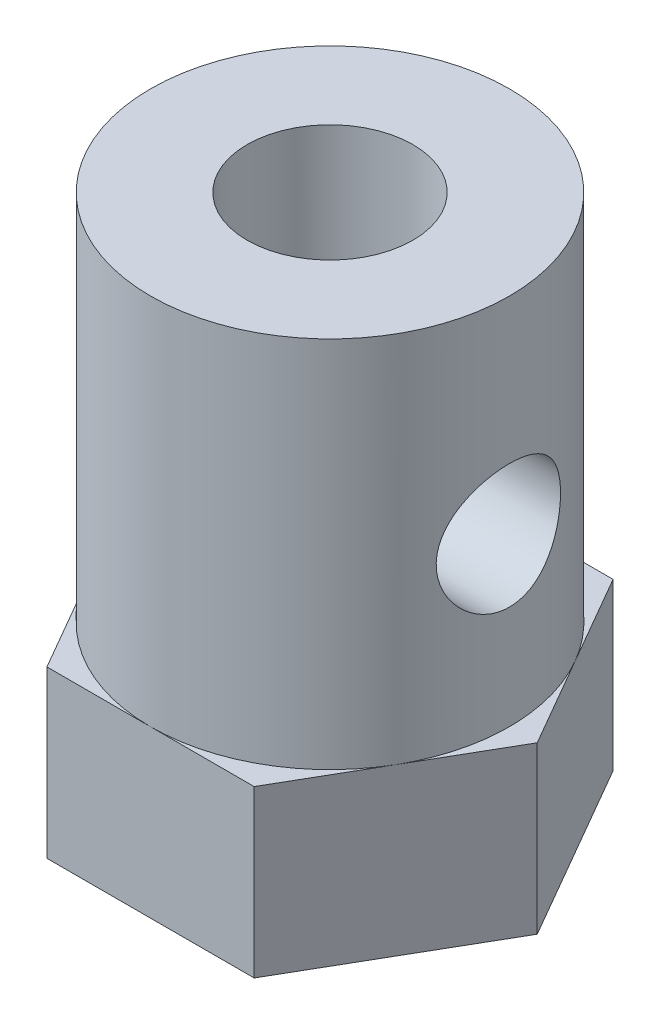
ISO-10303-21;
HEADER;
FILE_DESCRIPTION(('STEP AP214'),'2;1');
FILE_NAME('part.step','',(''),(''),'','','');
FILE_SCHEMA(('AUTOMOTIVE_DESIGN { 1 0 10303 214 1 1 1 1 }'));
ENDSEC;
DATA;
#1=APPLICATION_CONTEXT('core data for automotive mechanical design processes');
#2=APPLICATION_PROTOCOL_DEFINITION('international standard','automotive_design',2000,#1);
#3=PRODUCT_CONTEXT('',#1,'mechanical');
#4=PRODUCT('Part','Part','',(#3));
#5=PRODUCT_RELATED_PRODUCT_CATEGORY('part','',(#4));
#6=PRODUCT_DEFINITION_FORMATION('','',#4);
#7=PRODUCT_DEFINITION_CONTEXT('part definition',#1,'design');
#8=PRODUCT_DEFINITION('design','',#6,#7);
#9=PRODUCT_DEFINITION_SHAPE('','',#8);
#10=(LENGTH_UNIT() NAMED_UNIT(*) SI_UNIT(.MILLI.,.METRE.));
#11=(NAMED_UNIT(*) PLANE_ANGLE_UNIT() SI_UNIT($,.RADIAN.));
#12=(NAMED_UNIT(*) SI_UNIT($,.STERADIAN.) SOLID_ANGLE_UNIT());
#13=UNCERTAINTY_MEASURE_WITH_UNIT(LENGTH_MEASURE(1.E-05),#10,'distance_accuracy_value','');
#14=(GEOMETRIC_REPRESENTATION_CONTEXT(3) GLOBAL_UNCERTAINTY_ASSIGNED_CONTEXT((#13)) GLOBAL_UNIT_ASSIGNED_CONTEXT((#10,
#11,#12)) REPRESENTATION_CONTEXT('',''));
#15=CARTESIAN_POINT('',(0.,0.,0.));
#16=DIRECTION('',(0.,0.,1.));
#17=DIRECTION('',(1.,0.,0.));
#18=AXIS2_PLACEMENT_3D('',#15,#16,#17);
#19=CARTESIAN_POINT('',(0.,4.,0.));
#20=DIRECTION('',(0.,1.,0.));
#21=DIRECTION('',(0.,0.,1.));
#22=AXIS2_PLACEMENT_3D('',#19,#20,#21);
#23=PLANE('',#22);
#24=CARTESIAN_POINT('',(0.,4.,0.));
#25=DIRECTION('',(0.,1.,0.));
#26=DIRECTION('',(0.,0.,1.));
#27=AXIS2_PLACEMENT_3D('',#24,#25,#26);
#28=CIRCLE('',#27,4.33012701892221);
#29=CARTESIAN_POINT('',(-6.66133814775094E-12,4.,4.33012701892221));
#30=VERTEX_POINT('',#29);
#31=CARTESIAN_POINT('',(3.75,4.,2.16506350946109));
#32=VERTEX_POINT('',#31);
#33=EDGE_CURVE('E54',#30,#32,#28,.T.);
#34=ORIENTED_EDGE('',*,*,#33,.F.);
#35=DIRECTION('',(1.,0.,0.));
#36=VECTOR('',#35,1.);
#37=CARTESIAN_POINT('',(-6.66133814775094E-12,4.,4.3301270189222));
#38=LINE('',#37,#36);
#39=CARTESIAN_POINT('',(2.49999999999337,4.,4.3301270189222));
#40=VERTEX_POINT('',#39);
#41=EDGE_CURVE('E124',#30,#40,#38,.T.);
#42=ORIENTED_EDGE('',*,*,#41,.T.);
#43=DIRECTION('',(0.499999999999998,0.,-0.866025403784466));
#44=VECTOR('',#43,1.);
#45=CARTESIAN_POINT('',(3.75,4.,2.16506350946109));
#46=LINE('',#45,#44);
#47=EDGE_CURVE('E134',#40,#32,#46,.T.);
#48=ORIENTED_EDGE('',*,*,#47,.T.);
#49=EDGE_LOOP('',(#34,#42,#48));
#50=FACE_BOUND('',#49,.T.);
#51=ADVANCED_FACE('F38',(#50),#23,.T.);
#52=CARTESIAN_POINT('',(3.74999999999334,4.,-2.1650635094612));
#53=VERTEX_POINT('',#52);
#54=EDGE_CURVE('E11',#32,#53,#28,.T.);
#55=ORIENTED_EDGE('',*,*,#54,.F.);
#56=CARTESIAN_POINT('',(5.,4.,0.));
#57=VERTEX_POINT('',#56);
#58=EDGE_CURVE('E150',#32,#57,#46,.T.);
#59=ORIENTED_EDGE('',*,*,#58,.T.);
#60=DIRECTION('',(-0.5,0.,-0.866025403784439));
#61=VECTOR('',#60,1.);
#62=CARTESIAN_POINT('',(3.74999999999334,4.,-2.1650635094612));
#63=LINE('',#62,#61);
#64=EDGE_CURVE('E151',#57,#53,#63,.T.);
#65=ORIENTED_EDGE('',*,*,#64,.T.);
#66=EDGE_LOOP('',(#55,#59,#65));
#67=FACE_BOUND('',#66,.T.);
#68=ADVANCED_FACE('F259',(#67),#23,.T.);
#69=CARTESIAN_POINT('',(0.,4.,-4.33012701892219));
#70=VERTEX_POINT('',#69);
#71=EDGE_CURVE('E52',#53,#70,#28,.T.);
#72=ORIENTED_EDGE('',*,*,#71,.F.);
#73=CARTESIAN_POINT('',(2.5,4.,-4.33012701892219));
#74=VERTEX_POINT('',#73);
#75=EDGE_CURVE('E149',#53,#74,#63,.T.);
#76=ORIENTED_EDGE('',*,*,#75,.T.);
#77=DIRECTION('',(-1.,0.,0.));
#78=VECTOR('',#77,1.);
#79=CARTESIAN_POINT('',(0.,4.,-4.33012701892219));
#80=LINE('',#79,#78);
#81=EDGE_CURVE('E155',#74,#70,#80,.T.);
#82=ORIENTED_EDGE('',*,*,#81,.T.);
#83=EDGE_LOOP('',(#72,#76,#82));
#84=FACE_BOUND('',#83,.T.);
#85=ADVANCED_FACE('F263',(#84),#23,.T.);
#86=CARTESIAN_POINT('',(-3.75,4.,-2.1650635094612));
#87=VERTEX_POINT('',#86);
#88=EDGE_CURVE('E141',#70,#87,#28,.T.);
#89=ORIENTED_EDGE('',*,*,#88,.F.);
#90=CARTESIAN_POINT('',(-2.50000000000333,4.,-4.3301270189224));
#91=VERTEX_POINT('',#90);
#92=EDGE_CURVE('E154',#70,#91,#80,.T.);
#93=ORIENTED_EDGE('',*,*,#92,.T.);
#94=DIRECTION('',(-0.5,0.,0.866025403784465));
#95=VECTOR('',#94,1.);
#96=CARTESIAN_POINT('',(-3.75,4.,-2.1650635094612));
#97=LINE('',#96,#95);
#98=EDGE_CURVE('E159',#91,#87,#97,.T.);
#99=ORIENTED_EDGE('',*,*,#98,.T.);
#100=EDGE_LOOP('',(#89,#93,#99));
#101=FACE_BOUND('',#100,.T.);
#102=ADVANCED_FACE('F268',(#101),#23,.T.);
#103=CARTESIAN_POINT('',(-3.75000000000332,4.,2.16506350946089));
#104=VERTEX_POINT('',#103);
#105=EDGE_CURVE('E68',#87,#104,#28,.T.);
#106=ORIENTED_EDGE('',*,*,#105,.F.);
#107=CARTESIAN_POINT('',(-5.00000000000334,4.,-2.07299455379228E-13));
#108=VERTEX_POINT('',#107);
#109=EDGE_CURVE('E158',#87,#108,#97,.T.);
#110=ORIENTED_EDGE('',*,*,#109,.T.);
#111=DIRECTION('',(-0.500000000000001,0.,-0.866025403784465));
#112=VECTOR('',#111,1.);
#113=CARTESIAN_POINT('',(-3.75000000000332,4.,2.16506350946089));
#114=LINE('',#113,#112);
#115=EDGE_CURVE('E162',#104,#108,#114,.T.);
#116=ORIENTED_EDGE('',*,*,#115,.F.);
#117=EDGE_LOOP('',(#106,#110,#116));
#118=FACE_BOUND('',#117,.T.);
#119=ADVANCED_FACE('F256',(#118),#23,.T.);
#120=CARTESIAN_POINT('',(3.75,4.,2.16506350946109));
#121=DIRECTION('',(-0.866025403784467,0.,-0.499999999999998));
#122=DIRECTION('',(-0.499999999999998,0.,0.866025403784467));
#123=AXIS2_PLACEMENT_3D('',#120,#121,#122);
#124=PLANE('',#123);
#125=DIRECTION('',(0.499999999999998,0.,-0.866025403784466));
#126=VECTOR('',#125,1.);
#127=CARTESIAN_POINT('',(3.75,0.,2.16506350946109));
#128=LINE('',#127,#126);
#129=CARTESIAN_POINT('',(2.49999999999337,0.,4.3301270189222));
#130=VERTEX_POINT('',#129);
#131=CARTESIAN_POINT('',(5.,0.,0.));
#132=VERTEX_POINT('',#131);
#133=EDGE_CURVE('E164',#130,#132,#128,.T.);
#134=ORIENTED_EDGE('',*,*,#133,.T.);
#135=DIRECTION('',(0.,-1.,0.));
#136=VECTOR('',#135,1.);
#137=CARTESIAN_POINT('',(5.,4.,0.));
#138=LINE('',#137,#136);
#139=EDGE_CURVE('E140',#57,#132,#138,.T.);
#140=ORIENTED_EDGE('',*,*,#139,.F.);
#141=ORIENTED_EDGE('',*,*,#58,.F.);
#142=ORIENTED_EDGE('',*,*,#47,.F.);
#143=DIRECTION('',(0.,-1.,0.));
#144=VECTOR('',#143,1.);
#145=CARTESIAN_POINT('',(2.49999999999337,4.,4.3301270189222));
#146=LINE('',#145,#144);
#147=EDGE_CURVE('E123',#40,#130,#146,.T.);
#148=ORIENTED_EDGE('',*,*,#147,.T.);
#149=EDGE_LOOP('',(#134,#140,#141,#142,#148));
#150=FACE_BOUND('',#149,.T.);
#151=ADVANCED_FACE('F40',(#150),#124,.F.);
#152=CARTESIAN_POINT('',(3.74999999999334,4.,-2.1650635094612));
#153=DIRECTION('',(-0.866025403784439,0.,0.5));
#154=DIRECTION('',(0.5,0.,0.866025403784439));
#155=AXIS2_PLACEMENT_3D('',#152,#153,#154);
#156=PLANE('',#155);
#157=DIRECTION('',(-0.5,0.,-0.866025403784439));
#158=VECTOR('',#157,1.);
#159=CARTESIAN_POINT('',(3.74999999999334,0.,-2.1650635094611));
#160=LINE('',#159,#158);
#161=CARTESIAN_POINT('',(2.5,0.,-4.33012701892219));
#162=VERTEX_POINT('',#161);
#163=EDGE_CURVE('E167',#132,#162,#160,.T.);
#164=ORIENTED_EDGE('',*,*,#163,.T.);
#165=DIRECTION('',(0.,-1.,0.));
#166=VECTOR('',#165,1.);
#167=CARTESIAN_POINT('',(2.5,4.,-4.33012701892219));
#168=LINE('',#167,#166);
#169=EDGE_CURVE('E143',#74,#162,#168,.T.);
#170=ORIENTED_EDGE('',*,*,#169,.F.);
#171=ORIENTED_EDGE('',*,*,#75,.F.);
#172=ORIENTED_EDGE('',*,*,#64,.F.);
#173=ORIENTED_EDGE('',*,*,#139,.T.);
#174=EDGE_LOOP('',(#164,#170,#171,#172,#173));
#175=FACE_BOUND('',#174,.T.);
#176=ADVANCED_FACE('F249',(#175),#156,.F.);
#177=CARTESIAN_POINT('',(0.,4.,-4.33012701892219));
#178=DIRECTION('',(0.,0.,1.));
#179=DIRECTION('',(1.,0.,0.));
#180=AXIS2_PLACEMENT_3D('',#177,#178,#179);
#181=PLANE('',#180);
#182=DIRECTION('',(-1.,0.,0.));
#183=VECTOR('',#182,1.);
#184=CARTESIAN_POINT('',(0.,0.,-4.33012701892219));
#185=LINE('',#184,#183);
#186=CARTESIAN_POINT('',(-2.50000000000333,0.,-4.3301270189224));
#187=VERTEX_POINT('',#186);
#188=EDGE_CURVE('E169',#162,#187,#185,.T.);
#189=ORIENTED_EDGE('',*,*,#188,.T.);
#190=DIRECTION('',(0.,-1.,0.));
#191=VECTOR('',#190,1.);
#192=CARTESIAN_POINT('',(-2.50000000000333,4.,-4.3301270189224));
#193=LINE('',#192,#191);
#194=EDGE_CURVE('E184',#91,#187,#193,.T.);
#195=ORIENTED_EDGE('',*,*,#194,.F.);
#196=ORIENTED_EDGE('',*,*,#92,.F.);
#197=ORIENTED_EDGE('',*,*,#81,.F.);
#198=ORIENTED_EDGE('',*,*,#169,.T.);
#199=EDGE_LOOP('',(#189,#195,#196,#197,#198));
#200=FACE_BOUND('',#199,.T.);
#201=ADVANCED_FACE('F246',(#200),#181,.F.);
#202=CARTESIAN_POINT('',(-3.75,4.,-2.1650635094612));
#203=DIRECTION('',(0.866025403784465,0.,0.5));
#204=DIRECTION('',(0.5,0.,-0.866025403784465));
#205=AXIS2_PLACEMENT_3D('',#202,#203,#204);
#206=PLANE('',#205);
#207=DIRECTION('',(-0.5,0.,0.866025403784465));
#208=VECTOR('',#207,1.);
#209=CARTESIAN_POINT('',(-3.75,0.,-2.1650635094612));
#210=LINE('',#209,#208);
#211=CARTESIAN_POINT('',(-5.00000000000334,0.,-2.07299455379228E-13));
#212=VERTEX_POINT('',#211);
#213=EDGE_CURVE('E171',#187,#212,#210,.T.);
#214=ORIENTED_EDGE('',*,*,#213,.T.);
#215=DIRECTION('',(0.,-1.,0.));
#216=VECTOR('',#215,1.);
#217=CARTESIAN_POINT('',(-5.00000000000334,4.,-2.07299455379228E-13));
#218=LINE('',#217,#216);
#219=EDGE_CURVE('E182',#108,#212,#218,.T.);
#220=ORIENTED_EDGE('',*,*,#219,.F.);
#221=ORIENTED_EDGE('',*,*,#109,.F.);
#222=ORIENTED_EDGE('',*,*,#98,.F.);
#223=ORIENTED_EDGE('',*,*,#194,.T.);
#224=EDGE_LOOP('',(#214,#220,#221,#222,#223));
#225=FACE_BOUND('',#224,.T.);
#226=ADVANCED_FACE('F242',(#225),#206,.F.);
#227=CARTESIAN_POINT('',(-3.75000000000332,4.,2.16506350946089));
#228=DIRECTION('',(-0.866025403784465,0.,0.500000000000001));
#229=DIRECTION('',(0.500000000000001,0.,0.866025403784465));
#230=AXIS2_PLACEMENT_3D('',#227,#228,#229);
#231=PLANE('',#230);
#232=DIRECTION('',(-0.500000000000001,0.,-0.866025403784465));
#233=VECTOR('',#232,1.);
#234=CARTESIAN_POINT('',(-3.75000000000332,0.,2.16506350946089));
#235=LINE('',#234,#233);
#236=CARTESIAN_POINT('',(-2.49999999999999,0.,4.3301270189222));
#237=VERTEX_POINT('',#236);
#238=EDGE_CURVE('E174',#237,#212,#235,.T.);
#239=ORIENTED_EDGE('',*,*,#238,.F.);
#240=DIRECTION('',(0.,-1.,0.));
#241=VECTOR('',#240,1.);
#242=CARTESIAN_POINT('',(-2.49999999999999,4.,4.3301270189222));
#243=LINE('',#242,#241);
#244=CARTESIAN_POINT('',(-2.49999999999999,4.,4.3301270189222));
#245=VERTEX_POINT('',#244);
#246=EDGE_CURVE('E180',#245,#237,#243,.T.);
#247=ORIENTED_EDGE('',*,*,#246,.F.);
#248=EDGE_CURVE('E121',#245,#104,#114,.T.);
#249=ORIENTED_EDGE('',*,*,#248,.T.);
#250=ORIENTED_EDGE('',*,*,#115,.T.);
#251=ORIENTED_EDGE('',*,*,#219,.T.);
#252=EDGE_LOOP('',(#239,#247,#249,#250,#251));
#253=FACE_BOUND('',#252,.T.);
#254=ADVANCED_FACE('F239',(#253),#231,.T.);
#255=CARTESIAN_POINT('',(-6.66133814775094E-12,4.,4.3301270189222));
#256=DIRECTION('',(0.,0.,-1.));
#257=DIRECTION('',(-1.,0.,0.));
#258=AXIS2_PLACEMENT_3D('',#255,#256,#257);
#259=PLANE('',#258);
#260=DIRECTION('',(1.,0.,0.));
#261=VECTOR('',#260,1.);
#262=CARTESIAN_POINT('',(-6.66133814775094E-12,0.,4.3301270189222));
#263=LINE('',#262,#261);
#264=EDGE_CURVE('E177',#237,#130,#263,.T.);
#265=ORIENTED_EDGE('',*,*,#264,.T.);
#266=ORIENTED_EDGE('',*,*,#147,.F.);
#267=ORIENTED_EDGE('',*,*,#41,.F.);
#268=EDGE_CURVE('E117',#245,#30,#38,.T.);
#269=ORIENTED_EDGE('',*,*,#268,.F.);
#270=ORIENTED_EDGE('',*,*,#246,.T.);
#271=EDGE_LOOP('',(#265,#266,#267,#269,#270));
#272=FACE_BOUND('',#271,.T.);
#273=ADVANCED_FACE('F128',(#272),#259,.F.);
#274=EDGE_CURVE('E61',#104,#30,#28,.T.);
#275=ORIENTED_EDGE('',*,*,#274,.F.);
#276=ORIENTED_EDGE('',*,*,#248,.F.);
#277=ORIENTED_EDGE('',*,*,#268,.T.);
#278=EDGE_LOOP('',(#275,#276,#277));
#279=FACE_BOUND('',#278,.T.);
#280=ADVANCED_FACE('F119',(#279),#23,.T.);
#281=CARTESIAN_POINT('',(0.,0.,0.));
#282=DIRECTION('',(0.,1.,0.));
#283=DIRECTION('',(0.,0.,1.));
#284=AXIS2_PLACEMENT_3D('',#281,#282,#283);
#285=PLANE('',#284);
#286=CARTESIAN_POINT('',(0.,0.,0.));
#287=DIRECTION('',(0.,-1.,0.));
#288=DIRECTION('',(0.,0.,-1.));
#289=AXIS2_PLACEMENT_3D('',#286,#287,#288);
#290=CIRCLE('',#289,1.5);
#291=CARTESIAN_POINT('',(0.,0.,-1.5));
#292=VERTEX_POINT('',#291);
#293=EDGE_CURVE('E192',#292,#292,#290,.T.);
#294=ORIENTED_EDGE('',*,*,#293,.F.);
#295=EDGE_LOOP('',(#294));
#296=FACE_BOUND('',#295,.T.);
#297=ORIENTED_EDGE('',*,*,#133,.F.);
#298=ORIENTED_EDGE('',*,*,#264,.F.);
#299=ORIENTED_EDGE('',*,*,#238,.T.);
#300=ORIENTED_EDGE('',*,*,#213,.F.);
#301=ORIENTED_EDGE('',*,*,#188,.F.);
#302=ORIENTED_EDGE('',*,*,#163,.F.);
#303=EDGE_LOOP('',(#297,#298,#299,#300,#301,#302));
#304=FACE_BOUND('',#303,.T.);
#305=ADVANCED_FACE('F232',(#296,#304),#285,.F.);
#306=CARTESIAN_POINT('',(0.,13.,0.));
#307=DIRECTION('',(0.,1.,0.));
#308=DIRECTION('',(0.,0.,1.));
#309=AXIS2_PLACEMENT_3D('',#306,#307,#308);
#310=PLANE('',#309);
#311=CARTESIAN_POINT('',(0.,13.,0.));
#312=DIRECTION('',(0.,1.,0.));
#313=DIRECTION('',(0.,0.,1.));
#314=AXIS2_PLACEMENT_3D('',#311,#312,#313);
#315=CIRCLE('',#314,4.33012701892221);
#316=CARTESIAN_POINT('',(0.,13.,4.33012701892221));
#317=VERTEX_POINT('',#316);
#318=EDGE_CURVE('E136',#317,#317,#315,.T.);
#319=ORIENTED_EDGE('',*,*,#318,.T.);
#320=EDGE_LOOP('',(#319));
#321=FACE_BOUND('',#320,.T.);
#322=CARTESIAN_POINT('',(0.,13.,0.));
#323=DIRECTION('',(0.,1.,0.));
#324=DIRECTION('',(0.,0.,1.));
#325=AXIS2_PLACEMENT_3D('',#322,#323,#324);
#326=CIRCLE('',#325,2.);
#327=CARTESIAN_POINT('',(0.,13.,2.));
#328=VERTEX_POINT('',#327);
#329=EDGE_CURVE('E137',#328,#328,#326,.T.);
#330=ORIENTED_EDGE('',*,*,#329,.F.);
#331=EDGE_LOOP('',(#330));
#332=FACE_BOUND('',#331,.T.);
#333=ADVANCED_FACE('F227',(#321,#332),#310,.T.);
#334=CARTESIAN_POINT('',(0.,13.,0.));
#335=DIRECTION('',(0.,-1.,0.));
#336=DIRECTION('',(0.,0.,-1.));
#337=AXIS2_PLACEMENT_3D('',#334,#335,#336);
#338=CYLINDRICAL_SURFACE('',#337,4.33012701892221);
#339=CARTESIAN_POINT('',(-4.06201920232131,8.,-1.5));
#340=CARTESIAN_POINT('',(-4.0620182929735,8.08149384242594,-1.50000109692071));
#341=CARTESIAN_POINT('',(-4.06449840865831,8.16298005747082,-1.49333639244663));
#342=CARTESIAN_POINT('',(-4.07409406408558,8.32352527491766,-1.46695287751018));
#343=CARTESIAN_POINT('',(-4.0812100690114,8.4025840329053,-1.44723275701275));
#344=CARTESIAN_POINT('',(-4.09917682254192,8.55591984004069,-1.39552476684564));
#345=CARTESIAN_POINT('',(-4.11001976715491,8.63020649894419,-1.36356251561211));
#346=CARTESIAN_POINT('',(-4.13420696218893,8.77238908350489,-1.28836614745789));
#347=CARTESIAN_POINT('',(-4.14755183061948,8.84028342393375,-1.24512924450976));
#348=CARTESIAN_POINT('',(-4.17587211231416,8.97062582726067,-1.14665191787389));
#349=CARTESIAN_POINT('',(-4.19089047294617,9.03276442298301,-1.09101413863819));
#350=CARTESIAN_POINT('',(-4.22050401999654,9.14704229276042,-0.970160934592131));
#351=CARTESIAN_POINT('',(-4.23509913177774,9.19917981218382,-0.904943832681871));
#352=CARTESIAN_POINT('',(-4.26272293472891,9.29340554079385,-0.764494300228957));
#353=CARTESIAN_POINT('',(-4.27569528279136,9.33516583627602,-0.689029812235124));
#354=CARTESIAN_POINT('',(-4.29810285001062,9.4052747153079,-0.531619845384299));
#355=CARTESIAN_POINT('',(-4.30753910378192,9.43362722243642,-0.449676270733376));
#356=CARTESIAN_POINT('',(-4.32150688391253,9.47505549170981,-0.28488164148536));
#357=CARTESIAN_POINT('',(-4.3262084065539,9.48866218919827,-0.20217874168239));
#358=CARTESIAN_POINT('',(-4.33078243048287,9.50190470535982,-0.0355388462321525));
#359=CARTESIAN_POINT('',(-4.33065627390486,9.50154440697191,0.0483977999369503));
#360=CARTESIAN_POINT('',(-4.32570223413404,9.4871916276881,0.211350265431083));
#361=CARTESIAN_POINT('',(-4.32107353241765,9.4737766435985,0.290424015070444));
#362=CARTESIAN_POINT('',(-4.30788793658184,9.43465524190071,0.44511929953831));
#363=CARTESIAN_POINT('',(-4.29933077137609,9.40894797605007,0.520740595731899));
#364=CARTESIAN_POINT('',(-4.27900492525034,9.3456560607929,0.667601875613944));
#365=CARTESIAN_POINT('',(-4.26719400308702,9.30791408077393,0.73876796780092));
#366=CARTESIAN_POINT('',(-4.24157985861926,9.22175637750346,0.873921517182209));
#367=CARTESIAN_POINT('',(-4.22777605287052,9.17333752625298,0.937906862329129));
#368=CARTESIAN_POINT('',(-4.19879743628053,9.06432801025523,1.06030963761959));
#369=CARTESIAN_POINT('',(-4.18358859500853,9.0032455018528,1.11828163891195));
#370=CARTESIAN_POINT('',(-4.15409363209802,8.87210644320804,1.22331078561072));
#371=CARTESIAN_POINT('',(-4.1398076776847,8.80204827341702,1.27036595689058));
#372=CARTESIAN_POINT('',(-4.11358084408207,8.65343211189108,1.35291036458679));
#373=CARTESIAN_POINT('',(-4.10168248733041,8.57475307973665,1.38819623483381));
#374=CARTESIAN_POINT('',(-4.08206876612472,8.41205215289705,1.44486137842417));
#375=CARTESIAN_POINT('',(-4.07435147907949,8.32803273378742,1.4662470444364));
#376=CARTESIAN_POINT('',(-4.06441422274516,8.16137927493967,1.4935659944367));
#377=CARTESIAN_POINT('',(-4.06194690108261,8.07887409655318,1.50019527467375));
#378=CARTESIAN_POINT('',(-4.06209470725104,7.91391093402318,1.49979604955355));
#379=CARTESIAN_POINT('',(-4.06470881456575,7.83145294372956,1.49277028657328));
#380=CARTESIAN_POINT('',(-4.07447687879738,7.67220818770745,1.46588771883357));
#381=CARTESIAN_POINT('',(-4.08145393156273,7.59532506347827,1.44653037373499));
#382=CARTESIAN_POINT('',(-4.09896249797375,7.44591899478726,1.39614214438801));
#383=CARTESIAN_POINT('',(-4.10949467272957,7.37339686425279,1.36510908880248));
#384=CARTESIAN_POINT('',(-4.13336399703953,7.2320692304492,1.29106903068388));
#385=CARTESIAN_POINT('',(-4.14678347725183,7.16347037359045,1.24769486163039));
#386=CARTESIAN_POINT('',(-4.17476231286142,7.03427427771943,1.15061197040102));
#387=CARTESIAN_POINT('',(-4.18932202889424,6.97367958669024,1.09689997066689));
#388=CARTESIAN_POINT('',(-4.21886736668728,6.85891240660396,0.977313207778946));
#389=CARTESIAN_POINT('',(-4.23383508291711,6.80524566480935,0.910947144721774));
#390=CARTESIAN_POINT('',(-4.26176083046746,6.7097694412814,0.769781886735522));
#391=CARTESIAN_POINT('',(-4.27471891446737,6.66795964871277,0.694982912950867));
#392=CARTESIAN_POINT('',(-4.29711743032152,6.59774367512573,0.53936791933506));
#393=CARTESIAN_POINT('',(-4.30657818192408,6.56925980423038,0.458590038016722));
#394=CARTESIAN_POINT('',(-4.32100087895293,6.52641231384477,0.292994660825479));
#395=CARTESIAN_POINT('',(-4.32596459369276,6.51204314088215,0.208178767503917));
#396=CARTESIAN_POINT('',(-4.33068989814182,6.49836368234431,0.0415232226314644));
#397=CARTESIAN_POINT('',(-4.33070142028564,6.49832990421043,-0.0402505654856293));
#398=CARTESIAN_POINT('',(-4.32614737415796,6.51151440591161,-0.202584667856795));
#399=CARTESIAN_POINT('',(-4.32158222853726,6.52473146204508,-0.283145093466406));
#400=CARTESIAN_POINT('',(-4.30848682916174,6.56355216977874,-0.439288202327658));
#401=CARTESIAN_POINT('',(-4.30003064101729,6.58892479732304,-0.514934987255788));
#402=CARTESIAN_POINT('',(-4.28002546963462,6.65111816311571,-0.660920931215469));
#403=CARTESIAN_POINT('',(-4.2684759142221,6.68794101949433,-0.731259105234982));
#404=CARTESIAN_POINT('',(-4.24290735901403,6.77362493563821,-0.86760360905464));
#405=CARTESIAN_POINT('',(-4.22881007711133,6.82289679616944,-0.93333687560218));
#406=CARTESIAN_POINT('',(-4.19990242885403,6.93139741146517,-1.05583518751139));
#407=CARTESIAN_POINT('',(-4.18509182713904,6.99062946888812,-1.11259724599841));
#408=CARTESIAN_POINT('',(-4.15565826253555,7.12042411372765,-1.2180450933679));
#409=CARTESIAN_POINT('',(-4.14107105606214,7.1913656823296,-1.26627596483525));
#410=CARTESIAN_POINT('',(-4.11450385567478,7.34080696895524,-1.3501114062311));
#411=CARTESIAN_POINT('',(-4.10252344661609,7.41930548062384,-1.38571798720655));
#412=CARTESIAN_POINT('',(-4.08288756790855,7.58021657601073,-1.4425405859661));
#413=CARTESIAN_POINT('',(-4.07515581492659,7.66252922847324,-1.46401189656401));
#414=CARTESIAN_POINT('',(-4.06472317440837,7.82989814310703,-1.49273801378528));
#415=CARTESIAN_POINT('',(-4.06202015131447,7.9149532250281,-1.49999885525623));
#416=CARTESIAN_POINT('',(-4.06201920232131,8.,-1.5));
#417=B_SPLINE_CURVE_WITH_KNOTS('',3,(#339,#340,#341,#342,#343,#344,#345,#346,#347,#348,#349,
#350,#351,#352,#353,#354,#355,#356,#357,#358,#359,#360,#361,#362,#363,#364,#365,#366,#367,#368,
#369,#370,#371,#372,#373,#374,#375,#376,#377,#378,#379,#380,#381,#382,#383,#384,#385,#386,#387,
#388,#389,#390,#391,#392,#393,#394,#395,#396,#397,#398,#399,#400,#401,#402,#403,#404,#405,#406,
#407,#408,#409,#410,#411,#412,#413,#414,#415,#416),.UNSPECIFIED.,.T.,.F.,(4,2,2,2,2,2,2,2,2,2,2,
2,2,2,2,2,2,2,2,2,2,2,2,2,2,2,2,2,2,2,2,2,2,2,2,2,2,2,4),(0.,0.244166052125859,
0.488356608608952,0.732038928400172,0.975781520566179,1.22888876258863,1.48204037029586,
1.74239045711749,2.00266430935462,2.25321888533338,2.50370380559185,2.74358934887056,
2.98349144810481,3.22666808582051,3.4699160617832,3.72546969549251,3.98106950585449,
4.24088120804964,4.50057333879489,4.74773132879368,4.99483968655544,5.23252585249798,
5.47025624291041,5.71597141706244,5.96176462270906,6.22049209118142,6.47921277636913,
6.73640572758543,6.99349744484375,7.23761238346547,7.48170478038728,7.72133174492156,
7.96100306344925,8.20995152762204,8.45898270290181,8.71877376966473,8.97852343314908,
9.23344281066223,9.48825390647966),.UNSPECIFIED.);
#418=CARTESIAN_POINT('',(-4.06201920232131,8.,-1.5));
#419=VERTEX_POINT('',#418);
#420=EDGE_CURVE('E219',#419,#419,#417,.T.);
#421=ORIENTED_EDGE('',*,*,#420,.T.);
#422=EDGE_LOOP('',(#421));
#423=FACE_BOUND('',#422,.T.);
#424=CARTESIAN_POINT('',(4.06201920231133,8.,-1.5));
#425=CARTESIAN_POINT('',(4.06201829296376,7.91850615757439,-1.50000109692071));
#426=CARTESIAN_POINT('',(4.06449840865821,7.83701994252985,-1.49333639244673));
#427=CARTESIAN_POINT('',(4.07409406408563,7.67647472508273,-1.46695287751025));
#428=CARTESIAN_POINT('',(4.08121006900197,7.59741596709449,-1.4472327570127));
#429=CARTESIAN_POINT('',(4.09917682253143,7.44408015995931,-1.39552476684582));
#430=CARTESIAN_POINT('',(4.11001976715283,7.36979350105663,-1.3635625156126));
#431=CARTESIAN_POINT('',(4.13420696219071,7.22761091649603,-1.28836614745832));
#432=CARTESIAN_POINT('',(4.14755183061673,7.15971657606645,-1.24512924450983));
#433=CARTESIAN_POINT('',(4.17587211231022,7.02937417273925,-1.14665191787393));
#434=CARTESIAN_POINT('',(4.19089047294589,6.96723557701739,-1.09101413863861));
#435=CARTESIAN_POINT('',(4.2205040199966,6.85295770724005,-0.970160934592618));
#436=CARTESIAN_POINT('',(4.2350991317745,6.80082018781623,-0.904943832682048));
#437=CARTESIAN_POINT('',(4.2627229347255,6.70659445920606,-0.764494300229149));
#438=CARTESIAN_POINT('',(4.27569528279128,6.66483416372419,-0.689029812235655));
#439=CARTESIAN_POINT('',(4.29810285001054,6.59472528469239,-0.531619845384873));
#440=CARTESIAN_POINT('',(4.30753910377853,6.56637277756365,-0.449676270733655));
#441=CARTESIAN_POINT('',(4.32150688390929,6.52494450829012,-0.284881641485463));
#442=CARTESIAN_POINT('',(4.32620840655388,6.51133781080173,-0.202178741682595));
#443=CARTESIAN_POINT('',(4.33078243048288,6.49809529464022,-0.0355388462323727));
#444=CARTESIAN_POINT('',(4.3306562739017,6.49845559302809,0.0483977999368166));
#445=CARTESIAN_POINT('',(4.32570223413052,6.51280837231189,0.211350265431089));
#446=CARTESIAN_POINT('',(4.32107353241671,6.52622335640149,0.290424015070503));
#447=CARTESIAN_POINT('',(4.30788793658278,6.56534475809931,0.445119299538299));
#448=CARTESIAN_POINT('',(4.29933077137634,6.59105202394997,0.520740595731766));
#449=CARTESIAN_POINT('',(4.27900492525008,6.6543439392071,0.667601875613754));
#450=CARTESIAN_POINT('',(4.26719400308697,6.69208591922602,0.738767967800789));
#451=CARTESIAN_POINT('',(4.24157985861935,6.77824362249648,0.873921517182161));
#452=CARTESIAN_POINT('',(4.22777605287055,6.82666247374699,0.937906862329104));
#453=CARTESIAN_POINT('',(4.19879743628051,6.93567198974478,1.0603096376196));
#454=CARTESIAN_POINT('',(4.18358859500852,6.99675449814721,1.11828163891196));
#455=CARTESIAN_POINT('',(4.15409363209802,7.12789355679197,1.22331078561072));
#456=CARTESIAN_POINT('',(4.13980767768469,7.197951726583,1.27036595689057));
#457=CARTESIAN_POINT('',(4.11358084408205,7.34656788810891,1.3529103645868));
#458=CARTESIAN_POINT('',(4.10168248733041,7.42524692026332,1.38819623483386));
#459=CARTESIAN_POINT('',(4.08206876612473,7.58794784710293,1.4448613784241));
#460=CARTESIAN_POINT('',(4.07435147907949,7.67196726621258,1.46624704443617));
#461=CARTESIAN_POINT('',(4.06441422274516,7.83862072506034,1.49356599443651));
#462=CARTESIAN_POINT('',(4.06194690108262,7.92112590344683,1.50019527467375));
#463=CARTESIAN_POINT('',(4.06209470725104,8.08608906597682,1.49979604955355));
#464=CARTESIAN_POINT('',(4.06470881456574,8.16854705627044,1.49277028657309));
#465=CARTESIAN_POINT('',(4.07447687879737,8.32779181229255,1.46588771883335));
#466=CARTESIAN_POINT('',(4.08145393156274,8.40467493652175,1.44653037373493));
#467=CARTESIAN_POINT('',(4.09896249797375,8.55408100521277,1.39614214438806));
#468=CARTESIAN_POINT('',(4.10949467272956,8.62660313574723,1.36510908880249));
#469=CARTESIAN_POINT('',(4.13336399703952,8.76793076955077,1.29106903068387));
#470=CARTESIAN_POINT('',(4.14678347725182,8.83652962640949,1.24769486163038));
#471=CARTESIAN_POINT('',(4.1747623128614,8.96572572228052,1.15061197040111));
#472=CARTESIAN_POINT('',(4.18932202889421,9.02632041330977,1.09689997066707));
#473=CARTESIAN_POINT('',(4.2188673666873,9.14108759339609,0.977313207779123));
#474=CARTESIAN_POINT('',(4.23383508291718,9.19475433519068,0.910947144721845));
#475=CARTESIAN_POINT('',(4.26176083046739,9.2902305587186,0.769781886735419));
#476=CARTESIAN_POINT('',(4.27471891446709,9.33204035128721,0.694982912950695));
#477=CARTESIAN_POINT('',(4.29711743032175,9.40225632487423,0.539367919334927));
#478=CARTESIAN_POINT('',(4.30657818192506,9.43074019576961,0.458590038016704));
#479=CARTESIAN_POINT('',(4.32100087895195,9.47358768615524,0.292994660825529));
#480=CARTESIAN_POINT('',(4.3259645936891,9.48795685911786,0.20817876750392));
#481=CARTESIAN_POINT('',(4.33068989813884,9.50163631765569,0.0415232226313345));
#482=CARTESIAN_POINT('',(4.33070142028573,9.50167009578954,-0.0402505654858498));
#483=CARTESIAN_POINT('',(4.32614737415786,9.48848559408839,-0.202584667856999));
#484=CARTESIAN_POINT('',(4.3215822285339,9.475268537955,-0.283145093466503));
#485=CARTESIAN_POINT('',(4.30848682915844,9.43644783022119,-0.439288202327943));
#486=CARTESIAN_POINT('',(4.30003064101721,9.41107520267669,-0.51493498725636));
#487=CARTESIAN_POINT('',(4.28002546963455,9.34888183688409,-0.660920931216002));
#488=CARTESIAN_POINT('',(4.26847591421882,9.31205898050573,-0.731259105235186));
#489=CARTESIAN_POINT('',(4.24290735901065,9.22637506436175,-0.867603609054813));
#490=CARTESIAN_POINT('',(4.22881007711131,9.17710320383012,-0.933336875602681));
#491=CARTESIAN_POINT('',(4.19990242885383,9.06860258853443,-1.05583518751184));
#492=CARTESIAN_POINT('',(4.1850918271353,9.00937053111192,-1.11259724599846));
#493=CARTESIAN_POINT('',(4.15565826253262,8.87957588627216,-1.21804509336797));
#494=CARTESIAN_POINT('',(4.14107105606391,8.80863431766946,-1.26627596483572));
#495=CARTESIAN_POINT('',(4.1145038556727,8.65919303104392,-1.35011140623163));
#496=CARTESIAN_POINT('',(4.10252344660547,8.58069451937617,-1.38571798720673));
#497=CARTESIAN_POINT('',(4.08288756789923,8.41978342398948,-1.44254058596605));
#498=CARTESIAN_POINT('',(4.07515581492679,8.33747077152636,-1.46401189656409));
#499=CARTESIAN_POINT('',(4.06472317440811,8.17010185689229,-1.49273801378539));
#500=CARTESIAN_POINT('',(4.06202015130424,8.08504677497156,-1.49999885525623));
#501=CARTESIAN_POINT('',(4.06201920231133,8.,-1.5));
#502=B_SPLINE_CURVE_WITH_KNOTS('',3,(#424,#425,#426,#427,#428,#429,#430,#431,#432,#433,#434,
#435,#436,#437,#438,#439,#440,#441,#442,#443,#444,#445,#446,#447,#448,#449,#450,#451,#452,#453,
#454,#455,#456,#457,#458,#459,#460,#461,#462,#463,#464,#465,#466,#467,#468,#469,#470,#471,#472,
#473,#474,#475,#476,#477,#478,#479,#480,#481,#482,#483,#484,#485,#486,#487,#488,#489,#490,#491,
#492,#493,#494,#495,#496,#497,#498,#499,#500,#501),.UNSPECIFIED.,.T.,.F.,(4,2,2,2,2,2,2,2,2,2,2,
2,2,2,2,2,2,2,2,2,2,2,2,2,2,2,2,2,2,2,2,2,2,2,2,2,2,2,4),(0.,0.244166052125652,0.48835660860837,
0.732038928399914,0.975781520566415,1.22888876258881,1.48204037029595,1.74239045711764,
2.00266430935483,2.25321888533375,2.50370380559244,2.743589348871,2.98349144810502,
3.22666808582079,3.46991606178359,3.72546969549293,3.9810695058549,4.24088120805,
4.50057333879523,4.74773132879404,4.99483968655582,5.23252585249834,5.47025624291074,
5.7159714170627,5.96176462270925,6.2204920911818,6.47921277636966,6.73640572758574,
6.9934974448439,7.23761238346584,7.48170478038782,7.72133174492215,7.9610030634499,
8.20995152762259,8.45898270290233,8.71877376966575,8.97852343315044,9.2334428106632,
9.48825390648042),.UNSPECIFIED.);
#503=CARTESIAN_POINT('',(4.06201920231133,8.,-1.5));
#504=VERTEX_POINT('',#503);
#505=EDGE_CURVE('E213',#504,#504,#502,.T.);
#506=ORIENTED_EDGE('',*,*,#505,.T.);
#507=EDGE_LOOP('',(#506));
#508=FACE_BOUND('',#507,.T.);
#509=ORIENTED_EDGE('',*,*,#318,.F.);
#510=EDGE_LOOP('',(#509));
#511=FACE_BOUND('',#510,.T.);
#512=ORIENTED_EDGE('',*,*,#33,.T.);
#513=ORIENTED_EDGE('',*,*,#54,.T.);
#514=ORIENTED_EDGE('',*,*,#71,.T.);
#515=ORIENTED_EDGE('',*,*,#88,.T.);
#516=ORIENTED_EDGE('',*,*,#105,.T.);
#517=ORIENTED_EDGE('',*,*,#274,.T.);
#518=EDGE_LOOP('',(#512,#513,#514,#515,#516,#517));
#519=FACE_BOUND('',#518,.T.);
#520=ADVANCED_FACE('F138',(#423,#508,#511,#519),#338,.T.);
#521=CARTESIAN_POINT('',(0.,13.,0.));
#522=DIRECTION('',(0.,-1.,0.));
#523=DIRECTION('',(0.,0.,-1.));
#524=AXIS2_PLACEMENT_3D('',#521,#522,#523);
#525=CYLINDRICAL_SURFACE('',#524,2.);
#526=CARTESIAN_POINT('',(-1.32287565553561,8.,-1.5));
#527=CARTESIAN_POINT('',(-1.322891900445,8.06999742342597,-1.49999219049444));
#528=CARTESIAN_POINT('',(-1.32856366615425,8.1400458343126,-1.49504109074427));
#529=CARTESIAN_POINT('',(-1.34990644032764,8.27732985620989,-1.47578333210429));
#530=CARTESIAN_POINT('',(-1.36560725168985,8.34455644501931,-1.46144878565611));
#531=CARTESIAN_POINT('',(-1.40375127917219,8.47357984673854,-1.42483838991845));
#532=CARTESIAN_POINT('',(-1.42609848244853,8.53543877676359,-1.40267483444927));
#533=CARTESIAN_POINT('',(-1.47486455031279,8.65434545444628,-1.35130655299339));
#534=CARTESIAN_POINT('',(-1.50128292265226,8.71139378246932,-1.32210267801698));
#535=CARTESIAN_POINT('',(-1.56177312961524,8.83211279631643,-1.25039909811048));
#536=CARTESIAN_POINT('',(-1.59628904009853,8.89466793422747,-1.20639573950293));
#537=CARTESIAN_POINT('',(-1.6652116409641,9.01252546624345,-1.10933596759241));
#538=CARTESIAN_POINT('',(-1.69961809340185,9.06781696482048,-1.05626622282798));
#539=CARTESIAN_POINT('',(-1.77262582436611,9.18085873865519,-0.929610192252552));
#540=CARTESIAN_POINT('',(-1.8106492122978,9.23680596672041,-0.854047289141307));
#541=CARTESIAN_POINT('',(-1.87882809751683,9.33462220828357,-0.691189714821074));
#542=CARTESIAN_POINT('',(-1.90900204180524,9.37652429746891,-0.603923293836185));
#543=CARTESIAN_POINT('',(-1.9503425899052,9.43320768590287,-0.447869023983659));
#544=CARTESIAN_POINT('',(-1.96449710920997,9.45235709597858,-0.381446049692125));
#545=CARTESIAN_POINT('',(-1.98605635937579,9.48139011599692,-0.245552609316035));
#546=CARTESIAN_POINT('',(-1.99346695432701,9.49128177610678,-0.176084845994989));
#547=CARTESIAN_POINT('',(-2.00091375578415,9.50122173386245,-0.0358650926222099));
#548=CARTESIAN_POINT('',(-2.00093080057501,9.50124445437643,0.0348897591184215));
#549=CARTESIAN_POINT('',(-1.99354206503061,9.49138206321971,0.175316156673984));
#550=CARTESIAN_POINT('',(-1.98613456571646,9.48149465709182,0.244987447822375));
#551=CARTESIAN_POINT('',(-1.96491377944766,9.45291894941014,0.378889193792628));
#552=CARTESIAN_POINT('',(-1.95132857765786,9.434543673613,0.443224268235918));
#553=CARTESIAN_POINT('',(-1.91882278656934,9.39000435781787,0.567680485045864));
#554=CARTESIAN_POINT('',(-1.8999010339417,9.3638386194869,0.6278007050333));
#555=CARTESIAN_POINT('',(-1.85561045984532,9.30147038485465,0.749216921864602));
#556=CARTESIAN_POINT('',(-1.82976540608109,9.26448790338115,0.809935384713473));
#557=CARTESIAN_POINT('',(-1.77460702483736,9.18326629602942,0.924567250548222));
#558=CARTESIAN_POINT('',(-1.74529074780451,9.13902098630011,0.978474784621225));
#559=CARTESIAN_POINT('',(-1.67893765872365,9.03477665117907,1.08908204283327));
#560=CARTESIAN_POINT('',(-1.64151655866379,8.97339078997349,1.1442449300477));
#561=CARTESIAN_POINT('',(-1.56725958283777,8.84216541637795,1.24400875556217));
#562=CARTESIAN_POINT('',(-1.5304239936352,8.77232190047496,1.2886046621148));
#563=CARTESIAN_POINT('',(-1.46819425999164,8.63901812975436,1.35873206411597));
#564=CARTESIAN_POINT('',(-1.44197599790001,8.57701295469923,1.38628866868084));
#565=CARTESIAN_POINT('',(-1.39536741257408,8.4479347185805,1.43319397108769));
#566=CARTESIAN_POINT('',(-1.37496395320507,8.38087352030962,1.45256121808263));
#567=CARTESIAN_POINT('',(-1.34640050620237,8.25631305600169,1.47902385350666));
#568=CARTESIAN_POINT('',(-1.33661539556894,8.19955291788311,1.4877906949656));
#569=CARTESIAN_POINT('',(-1.32435588438356,8.08464453382612,1.49871760619769));
#570=CARTESIAN_POINT('',(-1.32187213058309,8.02649816009715,1.50088612873265));
#571=CARTESIAN_POINT('',(-1.32462868790498,7.91052100826664,1.49845270115552));
#572=CARTESIAN_POINT('',(-1.32987184207185,7.8526903541904,1.49384825899471));
#573=CARTESIAN_POINT('',(-1.3472121877507,7.73892384755718,1.47822527271948));
#574=CARTESIAN_POINT('',(-1.3593210772735,7.68299140205189,1.4671957805639));
#575=CARTESIAN_POINT('',(-1.39427758287796,7.55366195506114,1.43413959562392));
#576=CARTESIAN_POINT('',(-1.41944823697328,7.4815640460851,1.40954189769228));
#577=CARTESIAN_POINT('',(-1.47537861079992,7.34369233636001,1.35088877838418));
#578=CARTESIAN_POINT('',(-1.50614858477233,7.27793048270525,1.31681594335474));
#579=CARTESIAN_POINT('',(-1.57108282375647,7.15065099195187,1.23869774116698));
#580=CARTESIAN_POINT('',(-1.60532883846052,7.08936712378185,1.19434110060331));
#581=CARTESIAN_POINT('',(-1.67347506272371,6.97399790363887,1.09682562914579));
#582=CARTESIAN_POINT('',(-1.7073750957467,6.91991607201108,1.0436625219446));
#583=CARTESIAN_POINT('',(-1.77960222623526,6.80872300837063,0.916234513829674));
#584=CARTESIAN_POINT('',(-1.81728174165343,6.75352476114253,0.839896270946868));
#585=CARTESIAN_POINT('',(-1.88453104769838,6.65737926654926,0.675551612651283));
#586=CARTESIAN_POINT('',(-1.91411836052327,6.61640117541873,0.587571029974901));
#587=CARTESIAN_POINT('',(-1.95419406402351,6.5615620085531,0.430755661496824));
#588=CARTESIAN_POINT('',(-1.96775478029546,6.54324320672454,0.364250057327254));
#589=CARTESIAN_POINT('',(-1.98810265589223,6.51587120369249,0.228364464964134));
#590=CARTESIAN_POINT('',(-1.99489587107319,6.50680971845151,0.158987104561858));
#591=CARTESIAN_POINT('',(-2.00113566717369,6.49848360907139,0.0191476059405869));
#592=CARTESIAN_POINT('',(-2.00056500218901,6.49924198265169,-0.0513166925867587));
#593=CARTESIAN_POINT('',(-1.99208803243819,6.51056099130123,-0.191009011029926));
#594=CARTESIAN_POINT('',(-1.98417977344685,6.52112423770757,-0.260236696591447));
#595=CARTESIAN_POINT('',(-1.96203400925527,6.55097491616716,-0.393521935254848));
#596=CARTESIAN_POINT('',(-1.94798690792902,6.57000018132121,-0.457671236510748));
#597=CARTESIAN_POINT('',(-1.91462720575146,6.61578806561868,-0.581661343096858));
#598=CARTESIAN_POINT('',(-1.89531347862694,6.642552339831,-0.641501223389018));
#599=CARTESIAN_POINT('',(-1.85017642211001,6.70627793759586,-0.762547698767006));
#600=CARTESIAN_POINT('',(-1.82386352707633,6.74405093135884,-0.823141236712695));
#601=CARTESIAN_POINT('',(-1.7678550607574,6.82686644055353,-0.937414811723384));
#602=CARTESIAN_POINT('',(-1.73815638795961,6.87191563728609,-0.991088412383351));
#603=CARTESIAN_POINT('',(-1.67106353042471,6.97800536656077,-1.10112380660709));
#604=CARTESIAN_POINT('',(-1.63330922504734,7.04044639943878,-1.15591691541943));
#605=CARTESIAN_POINT('',(-1.55866082463385,7.17386807189884,-1.25475253429284));
#606=CARTESIAN_POINT('',(-1.52176704922289,7.24485182603672,-1.29879110556731));
#607=CARTESIAN_POINT('',(-1.46049601449566,7.37888325059021,-1.36695971301473));
#608=CARTESIAN_POINT('',(-1.43513625007617,7.44033498270553,-1.39333526337988));
#609=CARTESIAN_POINT('',(-1.39032564651282,7.56808291305487,-1.4380539802858));
#610=CARTESIAN_POINT('',(-1.37085915900116,7.63436569159539,-1.45641847678344));
#611=CARTESIAN_POINT('',(-1.34532423383532,7.75078821959699,-1.47997057756398));
#612=CARTESIAN_POINT('',(-1.33700130265658,7.79996707129013,-1.48744249026887));
#613=CARTESIAN_POINT('',(-1.32577295392438,7.89942233303317,-1.49745839072461));
#614=CARTESIAN_POINT('',(-1.32286398151425,7.94969800094348,-1.50000561211717));
#615=CARTESIAN_POINT('',(-1.32287565553561,8.,-1.5));
#616=B_SPLINE_CURVE_WITH_KNOTS('',3,(#526,#527,#528,#529,#530,#531,#532,#533,#534,#535,#536,
#537,#538,#539,#540,#541,#542,#543,#544,#545,#546,#547,#548,#549,#550,#551,#552,#553,#554,#555,
#556,#557,#558,#559,#560,#561,#562,#563,#564,#565,#566,#567,#568,#569,#570,#571,#572,#573,#574,
#575,#576,#577,#578,#579,#580,#581,#582,#583,#584,#585,#586,#587,#588,#589,#590,#591,#592,#593,
#594,#595,#596,#597,#598,#599,#600,#601,#602,#603,#604,#605,#606,#607,#608,#609,#610,#611,#612,
#613,#614,#615),.UNSPECIFIED.,.T.,.F.,(4,2,2,2,2,2,2,2,2,2,2,2,2,2,2,2,2,2,2,2,2,2,2,2,2,2,2,2,
2,2,2,2,2,2,2,2,2,2,2,2,2,2,2,2,4),(0.,0.209731776684762,0.42008972258349,0.627545385620779,
0.834975984673106,1.08585208691248,1.33710031031928,1.63964848103608,1.94147907445018,
2.15227725277591,2.36289195870735,2.57405250727819,2.78526195641277,2.98923755895055,
3.19325766108705,3.41936844116944,3.64567274887713,3.91649517204748,4.18744629647981,
4.40499409477243,4.6220464661305,4.79608005545942,4.96989060538231,5.14376512326249,
5.31793678696053,5.55730028202428,5.79710662639181,6.04543209090092,6.29387849446646,
6.59652499511479,6.89851088586591,7.10852896194477,7.31835893539238,7.52868041101077,
7.73905791773968,7.94332812691935,8.14764205379349,8.37510052489613,8.60276905744639,
8.8754758057815,9.1482822820853,9.36218279640848,9.57551025772729,9.72632812073815,
9.87704692032477),.UNSPECIFIED.);
#617=CARTESIAN_POINT('',(-1.32287565553561,8.,-1.5));
#618=VERTEX_POINT('',#617);
#619=EDGE_CURVE('E42',#618,#618,#616,.T.);
#620=ORIENTED_EDGE('',*,*,#619,.F.);
#621=EDGE_LOOP('',(#620));
#622=FACE_BOUND('',#621,.T.);
#623=CARTESIAN_POINT('',(1.32287565552563,8.,-1.5));
#624=CARTESIAN_POINT('',(1.32289190043297,7.93000257657487,-1.49999219049444));
#625=CARTESIAN_POINT('',(1.32856366615329,7.85995416568908,-1.49504109074453));
#626=CARTESIAN_POINT('',(1.34990644032817,7.72267014379115,-1.47578333210441));
#627=CARTESIAN_POINT('',(1.36560725168074,7.65544355498023,-1.46144878565583));
#628=CARTESIAN_POINT('',(1.40375127916149,7.52642015326141,-1.42483838991857));
#629=CARTESIAN_POINT('',(1.4260984824457,7.46456122323825,-1.40267483445011));
#630=CARTESIAN_POINT('',(1.47486455031399,7.34565454555585,-1.35130655299426));
#631=CARTESIAN_POINT('',(1.50128292264964,7.28860621753124,-1.32210267801716));
#632=CARTESIAN_POINT('',(1.56177312961088,7.16788720368322,-1.25039909811046));
#633=CARTESIAN_POINT('',(1.59628904009766,7.10533206577332,-1.20639573950368));
#634=CARTESIAN_POINT('',(1.66521164096389,6.98747453375761,-1.10933596759317));
#635=CARTESIAN_POINT('',(1.6996180933988,6.9321830351797,-1.05626622282801));
#636=CARTESIAN_POINT('',(1.77262582436245,6.81914126134457,-0.929610192252503));
#637=CARTESIAN_POINT('',(1.81064921229752,6.76319403328011,-0.854047289142245));
#638=CARTESIAN_POINT('',(1.87882809751628,6.66537779171711,-0.691189714822125));
#639=CARTESIAN_POINT('',(1.90900204180106,6.62347570253117,-0.603923293836361));
#640=CARTESIAN_POINT('',(1.95034258990247,6.56679231409706,-0.44786902398385));
#641=CARTESIAN_POINT('',(1.96449710921003,6.54764290402153,-0.38144604969274));
#642=CARTESIAN_POINT('',(1.98605635937551,6.51860988400325,-0.245552609316747));
#643=CARTESIAN_POINT('',(1.99346695432362,6.50871822389326,-0.176084845995376));
#644=CARTESIAN_POINT('',(2.00091375578088,6.49877826613751,-0.0358650926222364));
#645=CARTESIAN_POINT('',(2.00093080057497,6.49875554562356,0.0348897591184307));
#646=CARTESIAN_POINT('',(1.99354206503066,6.50861793678028,0.175316156673828));
#647=CARTESIAN_POINT('',(1.98613456571335,6.51850534290814,0.244987447822018));
#648=CARTESIAN_POINT('',(1.9649137794441,6.54708105058988,0.378889193792474));
#649=CARTESIAN_POINT('',(1.95132857765683,6.56545632638712,0.443224268236149));
#650=CARTESIAN_POINT('',(1.9188227865702,6.60999564218226,0.567680485046327));
#651=CARTESIAN_POINT('',(1.89990103394193,6.63616138051315,0.627800705033612));
#652=CARTESIAN_POINT('',(1.85561045984505,6.69852961514531,0.749216921864703));
#653=CARTESIAN_POINT('',(1.82976540608103,6.73551209661882,0.809935384713521));
#654=CARTESIAN_POINT('',(1.77460702483744,6.81673370397058,0.924567250548124));
#655=CARTESIAN_POINT('',(1.74529074780452,6.86097901369991,0.978474784621028));
#656=CARTESIAN_POINT('',(1.67893765872362,6.96522334882094,1.08908204283308));
#657=CARTESIAN_POINT('',(1.64151655866383,7.02660921002644,1.14424493004766));
#658=CARTESIAN_POINT('',(1.56725958283781,7.15783458362198,1.2440087555621));
#659=CARTESIAN_POINT('',(1.53042399363519,7.22767809952504,1.28860466211458));
#660=CARTESIAN_POINT('',(1.46819425999162,7.36098187024565,1.35873206411578));
#661=CARTESIAN_POINT('',(1.44197599790002,7.42298704530075,1.38628866868079));
#662=CARTESIAN_POINT('',(1.39536741257409,7.55206528141947,1.43319397108773));
#663=CARTESIAN_POINT('',(1.37496395320505,7.61912647969037,1.45256121808261));
#664=CARTESIAN_POINT('',(1.34640050620235,7.7436869439983,1.47902385350667));
#665=CARTESIAN_POINT('',(1.33661539556895,7.80044708211688,1.48779069496565));
#666=CARTESIAN_POINT('',(1.32435588438356,7.91535546617387,1.49871760619764));
#667=CARTESIAN_POINT('',(1.32187213058306,7.97350183990284,1.50088612873244));
#668=CARTESIAN_POINT('',(1.32462868790495,8.08947899173337,1.49845270115531));
#669=CARTESIAN_POINT('',(1.32987184207185,8.14730964580961,1.49384825899466));
#670=CARTESIAN_POINT('',(1.34721218775071,8.26107615244283,1.47822527271953));
#671=CARTESIAN_POINT('',(1.35932107727351,8.3170085979481,1.46719578056391));
#672=CARTESIAN_POINT('',(1.39427758287796,8.44633804493887,1.43413959562391));
#673=CARTESIAN_POINT('',(1.41944823697329,8.51843595391493,1.40954189769232));
#674=CARTESIAN_POINT('',(1.47537861079993,8.65630766364,1.35088877838412));
#675=CARTESIAN_POINT('',(1.5061485847723,8.72206951729472,1.31681594335455));
#676=CARTESIAN_POINT('',(1.57108282375646,8.84934900804813,1.23869774116677));
#677=CARTESIAN_POINT('',(1.60532883846056,8.91063287621822,1.19434110060325));
#678=CARTESIAN_POINT('',(1.67347506272374,9.02600209636119,1.09682562914575));
#679=CARTESIAN_POINT('',(1.70737509574666,9.08008392798892,1.04366252194443));
#680=CARTESIAN_POINT('',(1.77960222623528,9.19127699162937,0.916234513829413));
#681=CARTESIAN_POINT('',(1.81728174165363,9.24647523885758,0.83989627094668));
#682=CARTESIAN_POINT('',(1.88453104769833,9.34262073345085,0.675551612651098));
#683=CARTESIAN_POINT('',(1.91411836052283,9.38359882458128,0.587571029974656));
#684=CARTESIAN_POINT('',(1.95419406402378,9.43843799144687,0.430755661496707));
#685=CARTESIAN_POINT('',(1.96775478029642,9.45675679327544,0.364250057327276));
#686=CARTESIAN_POINT('',(1.98810265589126,9.48412879630752,0.228364464964158));
#687=CARTESIAN_POINT('',(1.9948958710696,9.49319028154851,0.158987104561744));
#688=CARTESIAN_POINT('',(2.0011356671706,9.50151639092861,0.0191476059401945));
#689=CARTESIAN_POINT('',(2.00056500218905,9.50075801734825,-0.0513166925872921));
#690=CARTESIAN_POINT('',(1.9920880324381,9.48943900869876,-0.191009011030284));
#691=CARTESIAN_POINT('',(1.98417977344351,9.47887576229252,-0.26023669659149));
#692=CARTESIAN_POINT('',(1.96203400925194,9.44902508383277,-0.393521935255142));
#693=CARTESIAN_POINT('',(1.94798690792876,9.4299998186785,-0.457671236511585));
#694=CARTESIAN_POINT('',(1.91462720575134,9.38421193438109,-0.581661343097454));
#695=CARTESIAN_POINT('',(1.89531347862385,9.35744766016907,-0.641501223388828));
#696=CARTESIAN_POINT('',(1.85017642210638,9.29372206240403,-0.762547698766833));
#697=CARTESIAN_POINT('',(1.82386352707576,9.25594906864049,-0.8231412367135));
#698=CARTESIAN_POINT('',(1.76785506075712,9.17313355944587,-0.937414811724332));
#699=CARTESIAN_POINT('',(1.73815638795656,9.12808436271397,-0.991088412383468));
#700=CARTESIAN_POINT('',(1.67106353042114,9.02199463343922,-1.10112380660689));
#701=CARTESIAN_POINT('',(1.63330922504712,8.95955360056021,-1.15591691542006));
#702=CARTESIAN_POINT('',(1.55866082463304,8.82613192810034,-1.25475253429358));
#703=CARTESIAN_POINT('',(1.52176704921815,8.75514817396365,-1.2987911055673));
#704=CARTESIAN_POINT('',(1.46049601449332,8.62111674940927,-1.36695971301485));
#705=CARTESIAN_POINT('',(1.43513625007811,8.55966501729244,-1.39333526338054));
#706=CARTESIAN_POINT('',(1.3903256465096,8.4319170869435,-1.43805398028642));
#707=CARTESIAN_POINT('',(1.3708591589885,8.36563430840489,-1.4564184767835));
#708=CARTESIAN_POINT('',(1.34532423382733,8.24921178040314,-1.47997057756388));
#709=CARTESIAN_POINT('',(1.3370013026566,8.20003292870904,-1.48744249026895));
#710=CARTESIAN_POINT('',(1.32577295392413,8.10057766696563,-1.49745839072474));
#711=CARTESIAN_POINT('',(1.32286398150574,8.05030199905591,-1.50000561211716));
#712=CARTESIAN_POINT('',(1.32287565552563,8.,-1.5));
#713=B_SPLINE_CURVE_WITH_KNOTS('',3,(#623,#624,#625,#626,#627,#628,#629,#630,#631,#632,#633,
#634,#635,#636,#637,#638,#639,#640,#641,#642,#643,#644,#645,#646,#647,#648,#649,#650,#651,#652,
#653,#654,#655,#656,#657,#658,#659,#660,#661,#662,#663,#664,#665,#666,#667,#668,#669,#670,#671,
#672,#673,#674,#675,#676,#677,#678,#679,#680,#681,#682,#683,#684,#685,#686,#687,#688,#689,#690,
#691,#692,#693,#694,#695,#696,#697,#698,#699,#700,#701,#702,#703,#704,#705,#706,#707,#708,#709,
#710,#711,#712),.UNSPECIFIED.,.T.,.F.,(4,2,2,2,2,2,2,2,2,2,2,2,2,2,2,2,2,2,2,2,2,2,2,2,2,2,2,2,
2,2,2,2,2,2,2,2,2,2,2,2,2,2,2,2,4),(0.,0.209731776684198,0.42008972258211,0.627545385620196,
0.834975984673635,1.08585208691307,1.3371003103198,1.63964848103659,1.94147907445078,
2.1522772527767,2.36289195870826,2.57405250727921,2.78526195641403,2.98923755895175,
3.19325766108803,3.4193684411702,3.6456727488778,3.91649517204818,4.1874462964805,
4.40499409477318,4.62204646613127,4.79608005546018,4.96989060538307,5.14376512326325,
5.31793678696127,5.55730028202506,5.79710662639263,6.04543209090173,6.2938784944673,
6.59652499511575,6.89851088586678,7.1085289619454,7.31835893539294,7.52868041101157,
7.73905791774058,7.94332812692015,8.14764205379428,8.37510052489712,8.60276905744747,
8.87547580578245,9.14828228208635,9.36218279641049,9.57551025772984,9.72632812074007,
9.87704692032627),.UNSPECIFIED.);
#714=CARTESIAN_POINT('',(1.32287565552563,8.,-1.5));
#715=VERTEX_POINT('',#714);
#716=EDGE_CURVE('E193',#715,#715,#713,.T.);
#717=ORIENTED_EDGE('',*,*,#716,.F.);
#718=EDGE_LOOP('',(#717));
#719=FACE_BOUND('',#718,.T.);
#720=ORIENTED_EDGE('',*,*,#329,.T.);
#721=EDGE_LOOP('',(#720));
#722=FACE_BOUND('',#721,.T.);
#723=CARTESIAN_POINT('',(0.,4.,0.));
#724=DIRECTION('',(0.,1.,0.));
#725=DIRECTION('',(0.,0.,1.));
#726=AXIS2_PLACEMENT_3D('',#723,#724,#725);
#727=CIRCLE('',#726,2.);
#728=CARTESIAN_POINT('',(0.,4.,2.));
#729=VERTEX_POINT('',#728);
#730=EDGE_CURVE('E191',#729,#729,#727,.T.);
#731=ORIENTED_EDGE('',*,*,#730,.F.);
#732=EDGE_LOOP('',(#731));
#733=FACE_BOUND('',#732,.T.);
#734=ADVANCED_FACE('F198',(#622,#719,#722,#733),#525,.F.);
#735=CARTESIAN_POINT('',(0.,4.,0.));
#736=DIRECTION('',(0.,1.,0.));
#737=DIRECTION('',(0.,0.,1.));
#738=AXIS2_PLACEMENT_3D('',#735,#736,#737);
#739=CIRCLE('',#738,1.5);
#740=CARTESIAN_POINT('',(0.,4.,1.5));
#741=VERTEX_POINT('',#740);
#742=EDGE_CURVE('E189',#741,#741,#739,.T.);
#743=ORIENTED_EDGE('',*,*,#742,.F.);
#744=EDGE_LOOP('',(#743));
#745=FACE_BOUND('',#744,.T.);
#746=ORIENTED_EDGE('',*,*,#730,.T.);
#747=EDGE_LOOP('',(#746));
#748=FACE_BOUND('',#747,.T.);
#749=ADVANCED_FACE('F233',(#745,#748),#23,.T.);
#750=CARTESIAN_POINT('',(0.,15.,0.));
#751=DIRECTION('',(0.,-1.,0.));
#752=DIRECTION('',(0.,0.,-1.));
#753=AXIS2_PLACEMENT_3D('',#750,#751,#752);
#754=CYLINDRICAL_SURFACE('',#753,1.5);
#755=ORIENTED_EDGE('',*,*,#742,.T.);
#756=EDGE_LOOP('',(#755));
#757=FACE_BOUND('',#756,.T.);
#758=ORIENTED_EDGE('',*,*,#293,.T.);
#759=EDGE_LOOP('',(#758));
#760=FACE_BOUND('',#759,.T.);
#761=ADVANCED_FACE('F207',(#757,#760),#754,.F.);
#762=CARTESIAN_POINT('',(-5.00000000000334,8.,-2.09034178855205E-13));
#763=DIRECTION('',(1.,0.,0.));
#764=DIRECTION('',(0.,0.,-1.));
#765=AXIS2_PLACEMENT_3D('',#762,#763,#764);
#766=CYLINDRICAL_SURFACE('',#765,1.5);
#767=ORIENTED_EDGE('',*,*,#716,.T.);
#768=EDGE_LOOP('',(#767));
#769=FACE_BOUND('',#768,.T.);
#770=ORIENTED_EDGE('',*,*,#505,.F.);
#771=EDGE_LOOP('',(#770));
#772=FACE_BOUND('',#771,.T.);
#773=ADVANCED_FACE('F205',(#769,#772),#766,.F.);
#774=ORIENTED_EDGE('',*,*,#619,.T.);
#775=EDGE_LOOP('',(#774));
#776=FACE_BOUND('',#775,.T.);
#777=ORIENTED_EDGE('',*,*,#420,.F.);
#778=EDGE_LOOP('',(#777));
#779=FACE_BOUND('',#778,.T.);
#780=ADVANCED_FACE('F202',(#776,#779),#766,.F.);
#781=CLOSED_SHELL('',(#51,#68,#85,#102,#119,#151,#176,#201,#226,#254,#273,#280,#305,#333,#520,
#734,#749,#761,#773,#780));
#782=MANIFOLD_SOLID_BREP('B2',#781);
#783=ADVANCED_BREP_SHAPE_REPRESENTATION('',(#18,#782),#14);
#784=SHAPE_DEFINITION_REPRESENTATION(#9,#783);
ENDSEC;
END-ISO-10303-21;
